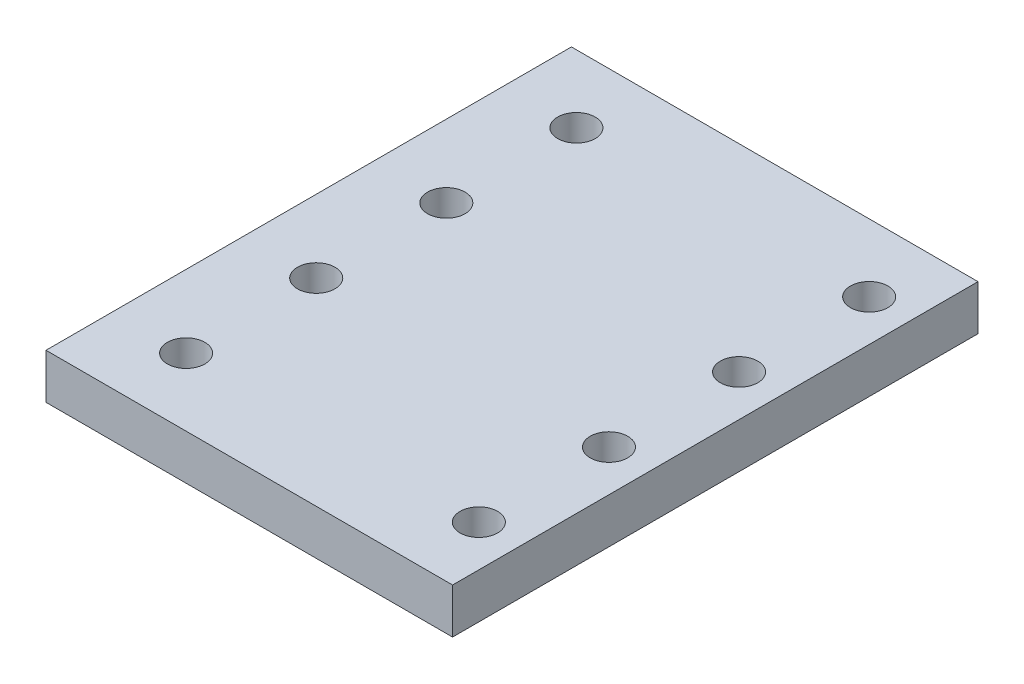
ISO-10303-21;
HEADER;
FILE_DESCRIPTION(('STEP AP214'),'2;1');
FILE_NAME('part.step','',(''),(''),'','','');
FILE_SCHEMA(('AUTOMOTIVE_DESIGN { 1 0 10303 214 1 1 1 1 }'));
ENDSEC;
DATA;
#1=APPLICATION_CONTEXT('core data for automotive mechanical design processes');
#2=APPLICATION_PROTOCOL_DEFINITION('international standard','automotive_design',2000,#1);
#3=PRODUCT_CONTEXT('',#1,'mechanical');
#4=PRODUCT('Part','Part','',(#3));
#5=PRODUCT_RELATED_PRODUCT_CATEGORY('part','',(#4));
#6=PRODUCT_DEFINITION_FORMATION('','',#4);
#7=PRODUCT_DEFINITION_CONTEXT('part definition',#1,'design');
#8=PRODUCT_DEFINITION('design','',#6,#7);
#9=PRODUCT_DEFINITION_SHAPE('','',#8);
#10=(LENGTH_UNIT() NAMED_UNIT(*) SI_UNIT(.MILLI.,.METRE.));
#11=(NAMED_UNIT(*) PLANE_ANGLE_UNIT() SI_UNIT($,.RADIAN.));
#12=(NAMED_UNIT(*) SI_UNIT($,.STERADIAN.) SOLID_ANGLE_UNIT());
#13=UNCERTAINTY_MEASURE_WITH_UNIT(LENGTH_MEASURE(1.E-05),#10,'distance_accuracy_value','');
#14=(GEOMETRIC_REPRESENTATION_CONTEXT(3) GLOBAL_UNCERTAINTY_ASSIGNED_CONTEXT((#13)) GLOBAL_UNIT_ASSIGNED_CONTEXT((#10,
#11,#12)) REPRESENTATION_CONTEXT('',''));
#15=CARTESIAN_POINT('',(0.,0.,0.));
#16=DIRECTION('',(0.,0.,1.));
#17=DIRECTION('',(1.,0.,0.));
#18=AXIS2_PLACEMENT_3D('',#15,#16,#17);
#19=CARTESIAN_POINT('',(0.,3.60651397990288,0.));
#20=DIRECTION('',(0.,1.,0.));
#21=DIRECTION('',(0.,0.,1.));
#22=AXIS2_PLACEMENT_3D('',#19,#20,#21);
#23=PLANE('',#22);
#24=CARTESIAN_POINT('',(-10.4931392623121,3.60651397990288,16.4627852462413));
#25=DIRECTION('',(0.,1.,0.));
#26=DIRECTION('',(0.,0.,1.));
#27=AXIS2_PLACEMENT_3D('',#24,#25,#26);
#28=CIRCLE('',#27,1.5);
#29=CARTESIAN_POINT('',(-10.4931392623121,3.60651397990288,17.9627852462413));
#30=VERTEX_POINT('',#29);
#31=EDGE_CURVE('E145',#30,#30,#28,.T.);
#32=ORIENTED_EDGE('',*,*,#31,.F.);
#33=EDGE_LOOP('',(#32));
#34=FACE_BOUND('',#33,.T.);
#35=CARTESIAN_POINT('',(-10.4931392623121,3.60651397990288,-14.7372147537587));
#36=DIRECTION('',(0.,1.,0.));
#37=DIRECTION('',(0.,0.,1.));
#38=AXIS2_PLACEMENT_3D('',#35,#36,#37);
#39=CIRCLE('',#38,1.5);
#40=CARTESIAN_POINT('',(-10.4931392623121,3.60651397990288,-13.2372147537587));
#41=VERTEX_POINT('',#40);
#42=EDGE_CURVE('E133',#41,#41,#39,.T.);
#43=ORIENTED_EDGE('',*,*,#42,.F.);
#44=EDGE_LOOP('',(#43));
#45=FACE_BOUND('',#44,.T.);
#46=CARTESIAN_POINT('',(12.9068607376879,3.60651397990288,6.06278524624131));
#47=DIRECTION('',(0.,1.,0.));
#48=DIRECTION('',(0.,0.,1.));
#49=AXIS2_PLACEMENT_3D('',#46,#47,#48);
#50=CIRCLE('',#49,1.5);
#51=CARTESIAN_POINT('',(12.9068607376879,3.60651397990288,7.56278524624132));
#52=VERTEX_POINT('',#51);
#53=EDGE_CURVE('E121',#52,#52,#50,.T.);
#54=ORIENTED_EDGE('',*,*,#53,.F.);
#55=EDGE_LOOP('',(#54));
#56=FACE_BOUND('',#55,.T.);
#57=CARTESIAN_POINT('',(12.9068607376879,3.60651397990288,-14.7372147537587));
#58=DIRECTION('',(0.,1.,0.));
#59=DIRECTION('',(0.,0.,1.));
#60=AXIS2_PLACEMENT_3D('',#57,#58,#59);
#61=CIRCLE('',#60,1.5);
#62=CARTESIAN_POINT('',(12.9068607376879,3.60651397990288,-13.2372147537587));
#63=VERTEX_POINT('',#62);
#64=EDGE_CURVE('E100',#63,#63,#61,.T.);
#65=ORIENTED_EDGE('',*,*,#64,.F.);
#66=EDGE_LOOP('',(#65));
#67=FACE_BOUND('',#66,.T.);
#68=DIRECTION('',(0.,0.,-1.));
#69=VECTOR('',#68,1.);
#70=CARTESIAN_POINT('',(16.2068607376879,3.60651397990288,21.8627852462412));
#71=LINE('',#70,#69);
#72=CARTESIAN_POINT('',(16.2068607376879,3.60651397990288,21.8627852462412));
#73=VERTEX_POINT('',#72);
#74=CARTESIAN_POINT('',(16.2068607376879,3.60651397990288,-20.1372147537588));
#75=VERTEX_POINT('',#74);
#76=EDGE_CURVE('E85',#73,#75,#71,.T.);
#77=ORIENTED_EDGE('',*,*,#76,.T.);
#78=DIRECTION('',(-1.,0.,0.));
#79=VECTOR('',#78,1.);
#80=CARTESIAN_POINT('',(16.2068607376879,3.60651397990288,-20.1372147537588));
#81=LINE('',#80,#79);
#82=CARTESIAN_POINT('',(-16.2931392623121,3.60651397990288,-20.1372147537588));
#83=VERTEX_POINT('',#82);
#84=EDGE_CURVE('E80',#75,#83,#81,.T.);
#85=ORIENTED_EDGE('',*,*,#84,.T.);
#86=DIRECTION('',(0.,0.,1.));
#87=VECTOR('',#86,1.);
#88=CARTESIAN_POINT('',(-16.2931392623121,3.60651397990288,21.8627852462412));
#89=LINE('',#88,#87);
#90=CARTESIAN_POINT('',(-16.2931392623121,3.60651397990288,21.8627852462412));
#91=VERTEX_POINT('',#90);
#92=EDGE_CURVE('E83',#83,#91,#89,.T.);
#93=ORIENTED_EDGE('',*,*,#92,.T.);
#94=DIRECTION('',(1.,0.,0.));
#95=VECTOR('',#94,1.);
#96=CARTESIAN_POINT('',(16.2068607376879,3.60651397990288,21.8627852462412));
#97=LINE('',#96,#95);
#98=EDGE_CURVE('E50',#91,#73,#97,.T.);
#99=ORIENTED_EDGE('',*,*,#98,.T.);
#100=EDGE_LOOP('',(#77,#85,#93,#99));
#101=FACE_BOUND('',#100,.T.);
#102=CARTESIAN_POINT('',(12.9068607376879,3.60651397990288,-4.33721475375869));
#103=DIRECTION('',(0.,1.,0.));
#104=DIRECTION('',(0.,0.,1.));
#105=AXIS2_PLACEMENT_3D('',#102,#103,#104);
#106=CIRCLE('',#105,1.5);
#107=CARTESIAN_POINT('',(12.9068607376879,3.60651397990288,-2.83721475375868));
#108=VERTEX_POINT('',#107);
#109=EDGE_CURVE('E115',#108,#108,#106,.T.);
#110=ORIENTED_EDGE('',*,*,#109,.F.);
#111=EDGE_LOOP('',(#110));
#112=FACE_BOUND('',#111,.T.);
#113=CARTESIAN_POINT('',(12.9068607376879,3.60651397990288,16.4627852462413));
#114=DIRECTION('',(0.,1.,0.));
#115=DIRECTION('',(0.,0.,1.));
#116=AXIS2_PLACEMENT_3D('',#113,#114,#115);
#117=CIRCLE('',#116,1.5);
#118=CARTESIAN_POINT('',(12.9068607376879,3.60651397990288,17.9627852462413));
#119=VERTEX_POINT('',#118);
#120=EDGE_CURVE('E127',#119,#119,#117,.T.);
#121=ORIENTED_EDGE('',*,*,#120,.F.);
#122=EDGE_LOOP('',(#121));
#123=FACE_BOUND('',#122,.T.);
#124=CARTESIAN_POINT('',(-10.4931392623121,3.60651397990288,-4.33721475375868));
#125=DIRECTION('',(0.,1.,0.));
#126=DIRECTION('',(0.,0.,1.));
#127=AXIS2_PLACEMENT_3D('',#124,#125,#126);
#128=CIRCLE('',#127,1.5);
#129=CARTESIAN_POINT('',(-10.4931392623121,3.60651397990288,-2.83721475375868));
#130=VERTEX_POINT('',#129);
#131=EDGE_CURVE('E139',#130,#130,#128,.T.);
#132=ORIENTED_EDGE('',*,*,#131,.F.);
#133=EDGE_LOOP('',(#132));
#134=FACE_BOUND('',#133,.T.);
#135=CARTESIAN_POINT('',(-10.4931392623121,3.60651397990288,6.06278524624132));
#136=DIRECTION('',(0.,1.,0.));
#137=DIRECTION('',(0.,0.,1.));
#138=AXIS2_PLACEMENT_3D('',#135,#136,#137);
#139=CIRCLE('',#138,1.5);
#140=CARTESIAN_POINT('',(-10.4931392623121,3.60651397990288,7.56278524624132));
#141=VERTEX_POINT('',#140);
#142=EDGE_CURVE('E151',#141,#141,#139,.T.);
#143=ORIENTED_EDGE('',*,*,#142,.F.);
#144=EDGE_LOOP('',(#143));
#145=FACE_BOUND('',#144,.T.);
#146=ADVANCED_FACE('F33',(#34,#45,#56,#67,#101,#112,#123,#134,#145),#23,.T.);
#147=CARTESIAN_POINT('',(0.,0.,0.));
#148=DIRECTION('',(0.,1.,0.));
#149=DIRECTION('',(0.,0.,1.));
#150=AXIS2_PLACEMENT_3D('',#147,#148,#149);
#151=PLANE('',#150);
#152=DIRECTION('',(0.,0.,-1.));
#153=VECTOR('',#152,1.);
#154=CARTESIAN_POINT('',(16.2068607376879,0.,21.8627852462412));
#155=LINE('',#154,#153);
#156=CARTESIAN_POINT('',(16.2068607376879,0.,21.8627852462412));
#157=VERTEX_POINT('',#156);
#158=CARTESIAN_POINT('',(16.2068607376879,0.,-20.1372147537588));
#159=VERTEX_POINT('',#158);
#160=EDGE_CURVE('E97',#157,#159,#155,.T.);
#161=ORIENTED_EDGE('',*,*,#160,.F.);
#162=DIRECTION('',(1.,0.,0.));
#163=VECTOR('',#162,1.);
#164=CARTESIAN_POINT('',(16.2068607376879,0.,21.8627852462412));
#165=LINE('',#164,#163);
#166=CARTESIAN_POINT('',(-16.2931392623121,0.,21.8627852462412));
#167=VERTEX_POINT('',#166);
#168=EDGE_CURVE('E73',#167,#157,#165,.T.);
#169=ORIENTED_EDGE('',*,*,#168,.F.);
#170=DIRECTION('',(0.,0.,1.));
#171=VECTOR('',#170,1.);
#172=CARTESIAN_POINT('',(-16.2931392623121,0.,21.8627852462412));
#173=LINE('',#172,#171);
#174=CARTESIAN_POINT('',(-16.2931392623121,0.,-20.1372147537588));
#175=VERTEX_POINT('',#174);
#176=EDGE_CURVE('E67',#175,#167,#173,.T.);
#177=ORIENTED_EDGE('',*,*,#176,.F.);
#178=DIRECTION('',(-1.,0.,0.));
#179=VECTOR('',#178,1.);
#180=CARTESIAN_POINT('',(16.2068607376879,0.,-20.1372147537588));
#181=LINE('',#180,#179);
#182=EDGE_CURVE('E89',#159,#175,#181,.T.);
#183=ORIENTED_EDGE('',*,*,#182,.F.);
#184=EDGE_LOOP('',(#161,#169,#177,#183));
#185=FACE_BOUND('',#184,.T.);
#186=CARTESIAN_POINT('',(12.9068607376879,0.,-14.7372147537587));
#187=DIRECTION('',(0.,1.,0.));
#188=DIRECTION('',(0.,0.,1.));
#189=AXIS2_PLACEMENT_3D('',#186,#187,#188);
#190=CIRCLE('',#189,1.5);
#191=CARTESIAN_POINT('',(12.9068607376879,0.,-13.2372147537587));
#192=VERTEX_POINT('',#191);
#193=EDGE_CURVE('E112',#192,#192,#190,.T.);
#194=ORIENTED_EDGE('',*,*,#193,.T.);
#195=EDGE_LOOP('',(#194));
#196=FACE_BOUND('',#195,.T.);
#197=CARTESIAN_POINT('',(12.9068607376879,0.,-4.33721475375869));
#198=DIRECTION('',(0.,1.,0.));
#199=DIRECTION('',(0.,0.,1.));
#200=AXIS2_PLACEMENT_3D('',#197,#198,#199);
#201=CIRCLE('',#200,1.5);
#202=CARTESIAN_POINT('',(12.9068607376879,0.,-2.83721475375868));
#203=VERTEX_POINT('',#202);
#204=EDGE_CURVE('E118',#203,#203,#201,.T.);
#205=ORIENTED_EDGE('',*,*,#204,.T.);
#206=EDGE_LOOP('',(#205));
#207=FACE_BOUND('',#206,.T.);
#208=CARTESIAN_POINT('',(12.9068607376879,0.,6.06278524624131));
#209=DIRECTION('',(0.,1.,0.));
#210=DIRECTION('',(0.,0.,1.));
#211=AXIS2_PLACEMENT_3D('',#208,#209,#210);
#212=CIRCLE('',#211,1.5);
#213=CARTESIAN_POINT('',(12.9068607376879,0.,7.56278524624132));
#214=VERTEX_POINT('',#213);
#215=EDGE_CURVE('E124',#214,#214,#212,.T.);
#216=ORIENTED_EDGE('',*,*,#215,.T.);
#217=EDGE_LOOP('',(#216));
#218=FACE_BOUND('',#217,.T.);
#219=CARTESIAN_POINT('',(12.9068607376879,0.,16.4627852462413));
#220=DIRECTION('',(0.,1.,0.));
#221=DIRECTION('',(0.,0.,1.));
#222=AXIS2_PLACEMENT_3D('',#219,#220,#221);
#223=CIRCLE('',#222,1.5);
#224=CARTESIAN_POINT('',(12.9068607376879,0.,17.9627852462413));
#225=VERTEX_POINT('',#224);
#226=EDGE_CURVE('E130',#225,#225,#223,.T.);
#227=ORIENTED_EDGE('',*,*,#226,.T.);
#228=EDGE_LOOP('',(#227));
#229=FACE_BOUND('',#228,.T.);
#230=CARTESIAN_POINT('',(-10.4931392623121,0.,-14.7372147537587));
#231=DIRECTION('',(0.,1.,0.));
#232=DIRECTION('',(0.,0.,1.));
#233=AXIS2_PLACEMENT_3D('',#230,#231,#232);
#234=CIRCLE('',#233,1.5);
#235=CARTESIAN_POINT('',(-10.4931392623121,0.,-13.2372147537587));
#236=VERTEX_POINT('',#235);
#237=EDGE_CURVE('E136',#236,#236,#234,.T.);
#238=ORIENTED_EDGE('',*,*,#237,.T.);
#239=EDGE_LOOP('',(#238));
#240=FACE_BOUND('',#239,.T.);
#241=CARTESIAN_POINT('',(-10.4931392623121,0.,-4.33721475375868));
#242=DIRECTION('',(0.,1.,0.));
#243=DIRECTION('',(0.,0.,1.));
#244=AXIS2_PLACEMENT_3D('',#241,#242,#243);
#245=CIRCLE('',#244,1.5);
#246=CARTESIAN_POINT('',(-10.4931392623121,0.,-2.83721475375868));
#247=VERTEX_POINT('',#246);
#248=EDGE_CURVE('E142',#247,#247,#245,.T.);
#249=ORIENTED_EDGE('',*,*,#248,.T.);
#250=EDGE_LOOP('',(#249));
#251=FACE_BOUND('',#250,.T.);
#252=CARTESIAN_POINT('',(-10.4931392623121,0.,16.4627852462413));
#253=DIRECTION('',(0.,1.,0.));
#254=DIRECTION('',(0.,0.,1.));
#255=AXIS2_PLACEMENT_3D('',#252,#253,#254);
#256=CIRCLE('',#255,1.5);
#257=CARTESIAN_POINT('',(-10.4931392623121,0.,17.9627852462413));
#258=VERTEX_POINT('',#257);
#259=EDGE_CURVE('E148',#258,#258,#256,.T.);
#260=ORIENTED_EDGE('',*,*,#259,.T.);
#261=EDGE_LOOP('',(#260));
#262=FACE_BOUND('',#261,.T.);
#263=CARTESIAN_POINT('',(-10.4931392623121,0.,6.06278524624132));
#264=DIRECTION('',(0.,1.,0.));
#265=DIRECTION('',(0.,0.,1.));
#266=AXIS2_PLACEMENT_3D('',#263,#264,#265);
#267=CIRCLE('',#266,1.5);
#268=CARTESIAN_POINT('',(-10.4931392623121,0.,7.56278524624132));
#269=VERTEX_POINT('',#268);
#270=EDGE_CURVE('E154',#269,#269,#267,.T.);
#271=ORIENTED_EDGE('',*,*,#270,.T.);
#272=EDGE_LOOP('',(#271));
#273=FACE_BOUND('',#272,.T.);
#274=ADVANCED_FACE('F108',(#185,#196,#207,#218,#229,#240,#251,#262,#273),#151,.F.);
#275=CARTESIAN_POINT('',(16.2068607376879,3.60651397990288,21.8627852462412));
#276=DIRECTION('',(-1.,0.,0.));
#277=DIRECTION('',(0.,0.,1.));
#278=AXIS2_PLACEMENT_3D('',#275,#276,#277);
#279=PLANE('',#278);
#280=ORIENTED_EDGE('',*,*,#160,.T.);
#281=DIRECTION('',(0.,-1.,0.));
#282=VECTOR('',#281,1.);
#283=CARTESIAN_POINT('',(16.2068607376879,3.60651397990288,-20.1372147537588));
#284=LINE('',#283,#282);
#285=EDGE_CURVE('E11',#75,#159,#284,.T.);
#286=ORIENTED_EDGE('',*,*,#285,.F.);
#287=ORIENTED_EDGE('',*,*,#76,.F.);
#288=DIRECTION('',(0.,-1.,0.));
#289=VECTOR('',#288,1.);
#290=CARTESIAN_POINT('',(16.2068607376879,3.60651397990288,21.8627852462412));
#291=LINE('',#290,#289);
#292=EDGE_CURVE('E93',#73,#157,#291,.T.);
#293=ORIENTED_EDGE('',*,*,#292,.T.);
#294=EDGE_LOOP('',(#280,#286,#287,#293));
#295=FACE_BOUND('',#294,.T.);
#296=ADVANCED_FACE('F35',(#295),#279,.F.);
#297=CARTESIAN_POINT('',(16.2068607376879,3.60651397990288,-20.1372147537588));
#298=DIRECTION('',(0.,0.,1.));
#299=DIRECTION('',(1.,0.,0.));
#300=AXIS2_PLACEMENT_3D('',#297,#298,#299);
#301=PLANE('',#300);
#302=ORIENTED_EDGE('',*,*,#182,.T.);
#303=DIRECTION('',(0.,-1.,0.));
#304=VECTOR('',#303,1.);
#305=CARTESIAN_POINT('',(-16.2931392623121,3.60651397990288,-20.1372147537588));
#306=LINE('',#305,#304);
#307=EDGE_CURVE('E42',#83,#175,#306,.T.);
#308=ORIENTED_EDGE('',*,*,#307,.F.);
#309=ORIENTED_EDGE('',*,*,#84,.F.);
#310=ORIENTED_EDGE('',*,*,#285,.T.);
#311=EDGE_LOOP('',(#302,#308,#309,#310));
#312=FACE_BOUND('',#311,.T.);
#313=ADVANCED_FACE('F88',(#312),#301,.F.);
#314=CARTESIAN_POINT('',(-16.2931392623121,3.60651397990288,21.8627852462412));
#315=DIRECTION('',(1.,0.,0.));
#316=DIRECTION('',(0.,0.,-1.));
#317=AXIS2_PLACEMENT_3D('',#314,#315,#316);
#318=PLANE('',#317);
#319=ORIENTED_EDGE('',*,*,#176,.T.);
#320=DIRECTION('',(0.,-1.,0.));
#321=VECTOR('',#320,1.);
#322=CARTESIAN_POINT('',(-16.2931392623121,3.60651397990288,21.8627852462412));
#323=LINE('',#322,#321);
#324=EDGE_CURVE('E90',#91,#167,#323,.T.);
#325=ORIENTED_EDGE('',*,*,#324,.F.);
#326=ORIENTED_EDGE('',*,*,#92,.F.);
#327=ORIENTED_EDGE('',*,*,#307,.T.);
#328=EDGE_LOOP('',(#319,#325,#326,#327));
#329=FACE_BOUND('',#328,.T.);
#330=ADVANCED_FACE('F91',(#329),#318,.F.);
#331=CARTESIAN_POINT('',(16.2068607376879,3.60651397990288,21.8627852462412));
#332=DIRECTION('',(0.,0.,-1.));
#333=DIRECTION('',(-1.,0.,0.));
#334=AXIS2_PLACEMENT_3D('',#331,#332,#333);
#335=PLANE('',#334);
#336=ORIENTED_EDGE('',*,*,#168,.T.);
#337=ORIENTED_EDGE('',*,*,#292,.F.);
#338=ORIENTED_EDGE('',*,*,#98,.F.);
#339=ORIENTED_EDGE('',*,*,#324,.T.);
#340=EDGE_LOOP('',(#336,#337,#338,#339));
#341=FACE_BOUND('',#340,.T.);
#342=ADVANCED_FACE('F105',(#341),#335,.F.);
#343=CARTESIAN_POINT('',(12.9068607376879,3.60651397990288,-14.7372147537587));
#344=DIRECTION('',(0.,-1.,0.));
#345=DIRECTION('',(0.,0.,-1.));
#346=AXIS2_PLACEMENT_3D('',#343,#344,#345);
#347=CYLINDRICAL_SURFACE('',#346,1.5);
#348=ORIENTED_EDGE('',*,*,#64,.T.);
#349=EDGE_LOOP('',(#348));
#350=FACE_BOUND('',#349,.T.);
#351=ORIENTED_EDGE('',*,*,#193,.F.);
#352=EDGE_LOOP('',(#351));
#353=FACE_BOUND('',#352,.T.);
#354=ADVANCED_FACE('F173',(#350,#353),#347,.F.);
#355=CARTESIAN_POINT('',(12.9068607376879,3.60651397990288,-4.33721475375869));
#356=DIRECTION('',(0.,-1.,0.));
#357=DIRECTION('',(0.,0.,-1.));
#358=AXIS2_PLACEMENT_3D('',#355,#356,#357);
#359=CYLINDRICAL_SURFACE('',#358,1.5);
#360=ORIENTED_EDGE('',*,*,#109,.T.);
#361=EDGE_LOOP('',(#360));
#362=FACE_BOUND('',#361,.T.);
#363=ORIENTED_EDGE('',*,*,#204,.F.);
#364=EDGE_LOOP('',(#363));
#365=FACE_BOUND('',#364,.T.);
#366=ADVANCED_FACE('F219',(#362,#365),#359,.F.);
#367=CARTESIAN_POINT('',(12.9068607376879,3.60651397990288,6.06278524624131));
#368=DIRECTION('',(0.,-1.,0.));
#369=DIRECTION('',(0.,0.,-1.));
#370=AXIS2_PLACEMENT_3D('',#367,#368,#369);
#371=CYLINDRICAL_SURFACE('',#370,1.5);
#372=ORIENTED_EDGE('',*,*,#53,.T.);
#373=EDGE_LOOP('',(#372));
#374=FACE_BOUND('',#373,.T.);
#375=ORIENTED_EDGE('',*,*,#215,.F.);
#376=EDGE_LOOP('',(#375));
#377=FACE_BOUND('',#376,.T.);
#378=ADVANCED_FACE('F227',(#374,#377),#371,.F.);
#379=CARTESIAN_POINT('',(12.9068607376879,3.60651397990288,16.4627852462413));
#380=DIRECTION('',(0.,-1.,0.));
#381=DIRECTION('',(0.,0.,-1.));
#382=AXIS2_PLACEMENT_3D('',#379,#380,#381);
#383=CYLINDRICAL_SURFACE('',#382,1.5);
#384=ORIENTED_EDGE('',*,*,#120,.T.);
#385=EDGE_LOOP('',(#384));
#386=FACE_BOUND('',#385,.T.);
#387=ORIENTED_EDGE('',*,*,#226,.F.);
#388=EDGE_LOOP('',(#387));
#389=FACE_BOUND('',#388,.T.);
#390=ADVANCED_FACE('F235',(#386,#389),#383,.F.);
#391=CARTESIAN_POINT('',(-10.4931392623121,3.60651397990288,-14.7372147537587));
#392=DIRECTION('',(0.,-1.,0.));
#393=DIRECTION('',(0.,0.,-1.));
#394=AXIS2_PLACEMENT_3D('',#391,#392,#393);
#395=CYLINDRICAL_SURFACE('',#394,1.5);
#396=ORIENTED_EDGE('',*,*,#42,.T.);
#397=EDGE_LOOP('',(#396));
#398=FACE_BOUND('',#397,.T.);
#399=ORIENTED_EDGE('',*,*,#237,.F.);
#400=EDGE_LOOP('',(#399));
#401=FACE_BOUND('',#400,.T.);
#402=ADVANCED_FACE('F244',(#398,#401),#395,.F.);
#403=CARTESIAN_POINT('',(-10.4931392623121,3.60651397990288,-4.33721475375868));
#404=DIRECTION('',(0.,-1.,0.));
#405=DIRECTION('',(0.,0.,-1.));
#406=AXIS2_PLACEMENT_3D('',#403,#404,#405);
#407=CYLINDRICAL_SURFACE('',#406,1.5);
#408=ORIENTED_EDGE('',*,*,#131,.T.);
#409=EDGE_LOOP('',(#408));
#410=FACE_BOUND('',#409,.T.);
#411=ORIENTED_EDGE('',*,*,#248,.F.);
#412=EDGE_LOOP('',(#411));
#413=FACE_BOUND('',#412,.T.);
#414=ADVANCED_FACE('F253',(#410,#413),#407,.F.);
#415=CARTESIAN_POINT('',(-10.4931392623121,3.60651397990288,16.4627852462413));
#416=DIRECTION('',(0.,-1.,0.));
#417=DIRECTION('',(0.,0.,-1.));
#418=AXIS2_PLACEMENT_3D('',#415,#416,#417);
#419=CYLINDRICAL_SURFACE('',#418,1.5);
#420=ORIENTED_EDGE('',*,*,#31,.T.);
#421=EDGE_LOOP('',(#420));
#422=FACE_BOUND('',#421,.T.);
#423=ORIENTED_EDGE('',*,*,#259,.F.);
#424=EDGE_LOOP('',(#423));
#425=FACE_BOUND('',#424,.T.);
#426=ADVANCED_FACE('F262',(#422,#425),#419,.F.);
#427=CARTESIAN_POINT('',(-10.4931392623121,3.60651397990288,6.06278524624132));
#428=DIRECTION('',(0.,-1.,0.));
#429=DIRECTION('',(0.,0.,-1.));
#430=AXIS2_PLACEMENT_3D('',#427,#428,#429);
#431=CYLINDRICAL_SURFACE('',#430,1.5);
#432=ORIENTED_EDGE('',*,*,#142,.T.);
#433=EDGE_LOOP('',(#432));
#434=FACE_BOUND('',#433,.T.);
#435=ORIENTED_EDGE('',*,*,#270,.F.);
#436=EDGE_LOOP('',(#435));
#437=FACE_BOUND('',#436,.T.);
#438=ADVANCED_FACE('F160',(#434,#437),#431,.F.);
#439=CLOSED_SHELL('',(#146,#274,#296,#313,#330,#342,#354,#366,#378,#390,#402,#414,#426,#438));
#440=MANIFOLD_SOLID_BREP('B2',#439);
#441=ADVANCED_BREP_SHAPE_REPRESENTATION('',(#18,#440),#14);
#442=SHAPE_DEFINITION_REPRESENTATION(#9,#441);
ENDSEC;
END-ISO-10303-21;
